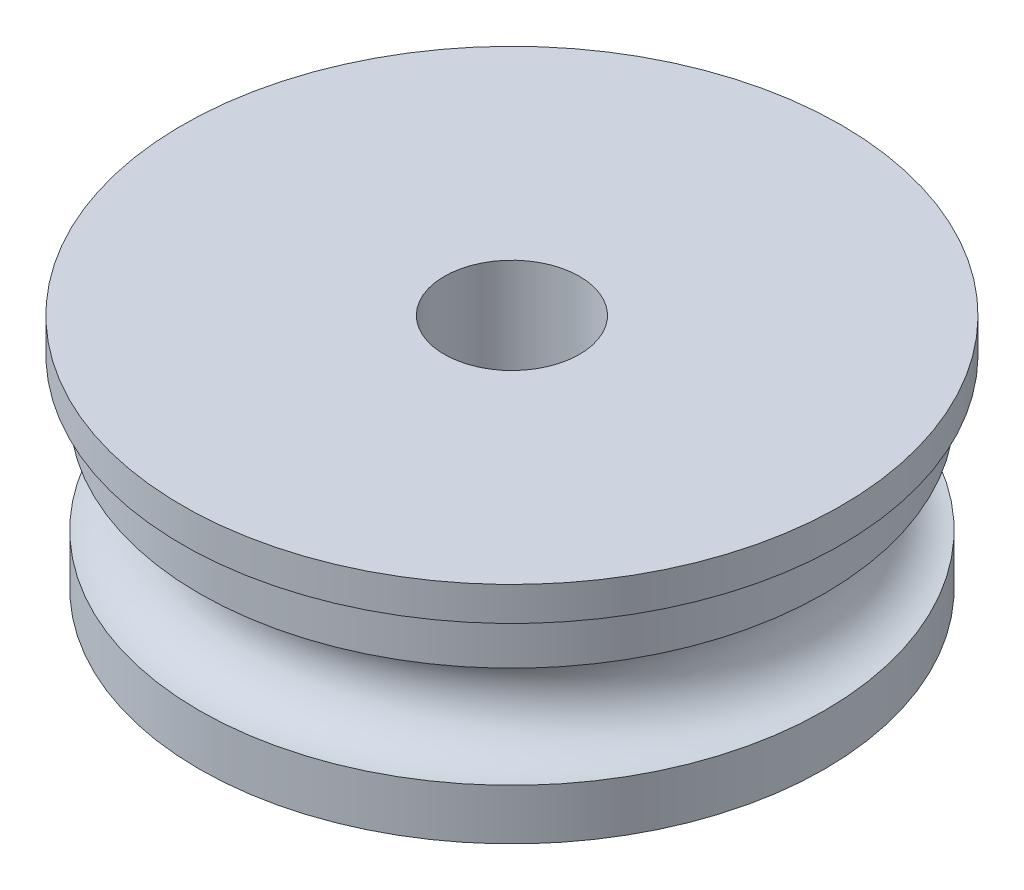
ISO-10303-21;
HEADER;
FILE_DESCRIPTION(('STEP AP214'),'2;1');
FILE_NAME('part.step','',(''),(''),'','','');
FILE_SCHEMA(('AUTOMOTIVE_DESIGN { 1 0 10303 214 1 1 1 1 }'));
ENDSEC;
DATA;
#1=APPLICATION_CONTEXT('core data for automotive mechanical design processes');
#2=APPLICATION_PROTOCOL_DEFINITION('international standard','automotive_design',2000,#1);
#3=PRODUCT_CONTEXT('',#1,'mechanical');
#4=PRODUCT('Part','Part','',(#3));
#5=PRODUCT_RELATED_PRODUCT_CATEGORY('part','',(#4));
#6=PRODUCT_DEFINITION_FORMATION('','',#4);
#7=PRODUCT_DEFINITION_CONTEXT('part definition',#1,'design');
#8=PRODUCT_DEFINITION('design','',#6,#7);
#9=PRODUCT_DEFINITION_SHAPE('','',#8);
#10=(LENGTH_UNIT() NAMED_UNIT(*) SI_UNIT(.MILLI.,.METRE.));
#11=(NAMED_UNIT(*) PLANE_ANGLE_UNIT() SI_UNIT($,.RADIAN.));
#12=(NAMED_UNIT(*) SI_UNIT($,.STERADIAN.) SOLID_ANGLE_UNIT());
#13=UNCERTAINTY_MEASURE_WITH_UNIT(LENGTH_MEASURE(1.E-05),#10,'distance_accuracy_value','');
#14=(GEOMETRIC_REPRESENTATION_CONTEXT(3) GLOBAL_UNCERTAINTY_ASSIGNED_CONTEXT((#13)) GLOBAL_UNIT_ASSIGNED_CONTEXT((#10,
#11,#12)) REPRESENTATION_CONTEXT('',''));
#15=CARTESIAN_POINT('',(0.,0.,0.));
#16=DIRECTION('',(0.,0.,1.));
#17=DIRECTION('',(1.,0.,0.));
#18=AXIS2_PLACEMENT_3D('',#15,#16,#17);
#19=CARTESIAN_POINT('',(0.,0.,0.));
#20=DIRECTION('',(0.,-1.,0.));
#21=DIRECTION('',(0.,0.,-1.));
#22=AXIS2_PLACEMENT_3D('',#19,#20,#21);
#23=CYLINDRICAL_SURFACE('',#22,2.);
#24=CARTESIAN_POINT('',(0.,3.,0.));
#25=DIRECTION('',(0.,-1.,0.));
#26=DIRECTION('',(0.,0.,-1.));
#27=AXIS2_PLACEMENT_3D('',#24,#25,#26);
#28=CIRCLE('',#27,2.);
#29=CARTESIAN_POINT('',(0.,3.,-2.));
#30=VERTEX_POINT('',#29);
#31=EDGE_CURVE('E10',#30,#30,#28,.T.);
#32=ORIENTED_EDGE('',*,*,#31,.T.);
#33=EDGE_LOOP('',(#32));
#34=FACE_BOUND('',#33,.T.);
#35=CARTESIAN_POINT('',(0.,7.,0.));
#36=DIRECTION('',(0.,-1.,0.));
#37=DIRECTION('',(0.,0.,-1.));
#38=AXIS2_PLACEMENT_3D('',#35,#36,#37);
#39=CIRCLE('',#38,2.);
#40=CARTESIAN_POINT('',(0.,7.,-2.));
#41=VERTEX_POINT('',#40);
#42=EDGE_CURVE('E65',#41,#41,#39,.T.);
#43=ORIENTED_EDGE('',*,*,#42,.F.);
#44=EDGE_LOOP('',(#43));
#45=FACE_BOUND('',#44,.T.);
#46=ADVANCED_FACE('F31',(#34,#45),#23,.F.);
#47=CARTESIAN_POINT('',(6.,3.,0.));
#48=DIRECTION('',(0.,-1.,0.));
#49=DIRECTION('',(0.,0.,-1.));
#50=AXIS2_PLACEMENT_3D('',#47,#48,#49);
#51=PLANE('',#50);
#52=CARTESIAN_POINT('',(0.,3.,0.));
#53=DIRECTION('',(0.,-1.,0.));
#54=DIRECTION('',(0.,0.,-1.));
#55=AXIS2_PLACEMENT_3D('',#52,#53,#54);
#56=CIRCLE('',#55,6.);
#57=CARTESIAN_POINT('',(0.,3.,-6.));
#58=VERTEX_POINT('',#57);
#59=EDGE_CURVE('E37',#58,#58,#56,.T.);
#60=ORIENTED_EDGE('',*,*,#59,.T.);
#61=EDGE_LOOP('',(#60));
#62=FACE_BOUND('',#61,.T.);
#63=ORIENTED_EDGE('',*,*,#31,.F.);
#64=EDGE_LOOP('',(#63));
#65=FACE_BOUND('',#64,.T.);
#66=ADVANCED_FACE('F73',(#62,#65),#51,.T.);
#67=CARTESIAN_POINT('',(0.,0.,0.));
#68=DIRECTION('',(0.,-1.,0.));
#69=DIRECTION('',(0.,0.,-1.));
#70=AXIS2_PLACEMENT_3D('',#67,#68,#69);
#71=CYLINDRICAL_SURFACE('',#70,6.);
#72=CARTESIAN_POINT('',(0.,0.,0.));
#73=DIRECTION('',(0.,-1.,0.));
#74=DIRECTION('',(0.,0.,-1.));
#75=AXIS2_PLACEMENT_3D('',#72,#73,#74);
#76=CIRCLE('',#75,6.);
#77=CARTESIAN_POINT('',(0.,0.,-6.));
#78=VERTEX_POINT('',#77);
#79=EDGE_CURVE('E41',#78,#78,#76,.T.);
#80=ORIENTED_EDGE('',*,*,#79,.T.);
#81=EDGE_LOOP('',(#80));
#82=FACE_BOUND('',#81,.T.);
#83=ORIENTED_EDGE('',*,*,#59,.F.);
#84=EDGE_LOOP('',(#83));
#85=FACE_BOUND('',#84,.T.);
#86=ADVANCED_FACE('F77',(#82,#85),#71,.F.);
#87=CARTESIAN_POINT('',(9.25,0.,0.));
#88=DIRECTION('',(0.,-1.,0.));
#89=DIRECTION('',(0.,0.,-1.));
#90=AXIS2_PLACEMENT_3D('',#87,#88,#89);
#91=PLANE('',#90);
#92=CARTESIAN_POINT('',(0.,0.,0.));
#93=DIRECTION('',(0.,-1.,0.));
#94=DIRECTION('',(0.,0.,-1.));
#95=AXIS2_PLACEMENT_3D('',#92,#93,#94);
#96=CIRCLE('',#95,9.25);
#97=CARTESIAN_POINT('',(0.,0.,-9.25));
#98=VERTEX_POINT('',#97);
#99=EDGE_CURVE('E45',#98,#98,#96,.T.);
#100=ORIENTED_EDGE('',*,*,#99,.T.);
#101=EDGE_LOOP('',(#100));
#102=FACE_BOUND('',#101,.T.);
#103=ORIENTED_EDGE('',*,*,#79,.F.);
#104=EDGE_LOOP('',(#103));
#105=FACE_BOUND('',#104,.T.);
#106=ADVANCED_FACE('F81',(#102,#105),#91,.T.);
#107=CARTESIAN_POINT('',(0.,0.,0.));
#108=DIRECTION('',(0.,-1.,0.));
#109=DIRECTION('',(0.,0.,-1.));
#110=AXIS2_PLACEMENT_3D('',#107,#108,#109);
#111=CYLINDRICAL_SURFACE('',#110,9.25);
#112=CARTESIAN_POINT('',(0.,1.5,0.));
#113=DIRECTION('',(0.,-1.,0.));
#114=DIRECTION('',(0.,0.,-1.));
#115=AXIS2_PLACEMENT_3D('',#112,#113,#114);
#116=CIRCLE('',#115,9.25);
#117=CARTESIAN_POINT('',(0.,1.5,-9.25));
#118=VERTEX_POINT('',#117);
#119=EDGE_CURVE('E50',#118,#118,#116,.T.);
#120=ORIENTED_EDGE('',*,*,#119,.T.);
#121=EDGE_LOOP('',(#120));
#122=FACE_BOUND('',#121,.T.);
#123=ORIENTED_EDGE('',*,*,#99,.F.);
#124=EDGE_LOOP('',(#123));
#125=FACE_BOUND('',#124,.T.);
#126=ADVANCED_FACE('F88',(#122,#125),#111,.T.);
#127=CARTESIAN_POINT('',(0.,3.,0.));
#128=DIRECTION('',(0.,-1.,0.));
#129=DIRECTION('',(0.,0.,-1.));
#130=AXIS2_PLACEMENT_3D('',#127,#128,#129);
#131=TOROIDAL_SURFACE('',#130,9.25,1.5);
#132=CARTESIAN_POINT('',(0.,4.5,0.));
#133=DIRECTION('',(0.,-1.,0.));
#134=DIRECTION('',(0.,0.,-1.));
#135=AXIS2_PLACEMENT_3D('',#132,#133,#134);
#136=CIRCLE('',#135,9.25);
#137=CARTESIAN_POINT('',(0.,4.5,-9.25));
#138=VERTEX_POINT('',#137);
#139=EDGE_CURVE('E53',#138,#138,#136,.T.);
#140=ORIENTED_EDGE('',*,*,#139,.T.);
#141=EDGE_LOOP('',(#140));
#142=FACE_BOUND('',#141,.T.);
#143=ORIENTED_EDGE('',*,*,#119,.F.);
#144=EDGE_LOOP('',(#143));
#145=FACE_BOUND('',#144,.T.);
#146=ADVANCED_FACE('F92',(#142,#145),#131,.F.);
#147=CARTESIAN_POINT('',(0.,0.,0.));
#148=DIRECTION('',(0.,-1.,0.));
#149=DIRECTION('',(0.,0.,-1.));
#150=AXIS2_PLACEMENT_3D('',#147,#148,#149);
#151=CYLINDRICAL_SURFACE('',#150,9.25);
#152=CARTESIAN_POINT('',(0.,6.,0.));
#153=DIRECTION('',(0.,-1.,0.));
#154=DIRECTION('',(0.,0.,-1.));
#155=AXIS2_PLACEMENT_3D('',#152,#153,#154);
#156=CIRCLE('',#155,9.25);
#157=CARTESIAN_POINT('',(0.,6.,-9.25));
#158=VERTEX_POINT('',#157);
#159=EDGE_CURVE('E56',#158,#158,#156,.T.);
#160=ORIENTED_EDGE('',*,*,#159,.T.);
#161=EDGE_LOOP('',(#160));
#162=FACE_BOUND('',#161,.T.);
#163=ORIENTED_EDGE('',*,*,#139,.F.);
#164=EDGE_LOOP('',(#163));
#165=FACE_BOUND('',#164,.T.);
#166=ADVANCED_FACE('F96',(#162,#165),#151,.T.);
#167=CARTESIAN_POINT('',(9.75,6.,0.));
#168=DIRECTION('',(0.,-1.,0.));
#169=DIRECTION('',(0.,0.,-1.));
#170=AXIS2_PLACEMENT_3D('',#167,#168,#169);
#171=PLANE('',#170);
#172=CARTESIAN_POINT('',(0.,6.,0.));
#173=DIRECTION('',(0.,-1.,0.));
#174=DIRECTION('',(0.,0.,-1.));
#175=AXIS2_PLACEMENT_3D('',#172,#173,#174);
#176=CIRCLE('',#175,9.75);
#177=CARTESIAN_POINT('',(0.,6.,-9.75));
#178=VERTEX_POINT('',#177);
#179=EDGE_CURVE('E59',#178,#178,#176,.T.);
#180=ORIENTED_EDGE('',*,*,#179,.T.);
#181=EDGE_LOOP('',(#180));
#182=FACE_BOUND('',#181,.T.);
#183=ORIENTED_EDGE('',*,*,#159,.F.);
#184=EDGE_LOOP('',(#183));
#185=FACE_BOUND('',#184,.T.);
#186=ADVANCED_FACE('F100',(#182,#185),#171,.T.);
#187=CARTESIAN_POINT('',(0.,0.,0.));
#188=DIRECTION('',(0.,-1.,0.));
#189=DIRECTION('',(0.,0.,-1.));
#190=AXIS2_PLACEMENT_3D('',#187,#188,#189);
#191=CYLINDRICAL_SURFACE('',#190,9.75);
#192=CARTESIAN_POINT('',(0.,7.,0.));
#193=DIRECTION('',(0.,-1.,0.));
#194=DIRECTION('',(0.,0.,-1.));
#195=AXIS2_PLACEMENT_3D('',#192,#193,#194);
#196=CIRCLE('',#195,9.75);
#197=CARTESIAN_POINT('',(0.,7.,-9.75));
#198=VERTEX_POINT('',#197);
#199=EDGE_CURVE('E62',#198,#198,#196,.T.);
#200=ORIENTED_EDGE('',*,*,#199,.T.);
#201=EDGE_LOOP('',(#200));
#202=FACE_BOUND('',#201,.T.);
#203=ORIENTED_EDGE('',*,*,#179,.F.);
#204=EDGE_LOOP('',(#203));
#205=FACE_BOUND('',#204,.T.);
#206=ADVANCED_FACE('F104',(#202,#205),#191,.T.);
#207=CARTESIAN_POINT('',(2.,7.,0.));
#208=DIRECTION('',(0.,1.,0.));
#209=DIRECTION('',(0.,0.,1.));
#210=AXIS2_PLACEMENT_3D('',#207,#208,#209);
#211=PLANE('',#210);
#212=ORIENTED_EDGE('',*,*,#42,.T.);
#213=EDGE_LOOP('',(#212));
#214=FACE_BOUND('',#213,.T.);
#215=ORIENTED_EDGE('',*,*,#199,.F.);
#216=EDGE_LOOP('',(#215));
#217=FACE_BOUND('',#216,.T.);
#218=ADVANCED_FACE('F69',(#214,#217),#211,.T.);
#219=CLOSED_SHELL('',(#46,#66,#86,#106,#126,#146,#166,#186,#206,#218));
#220=MANIFOLD_SOLID_BREP('B2',#219);
#221=ADVANCED_BREP_SHAPE_REPRESENTATION('',(#18,#220),#14);
#222=SHAPE_DEFINITION_REPRESENTATION(#9,#221);
ENDSEC;
END-ISO-10303-21;
